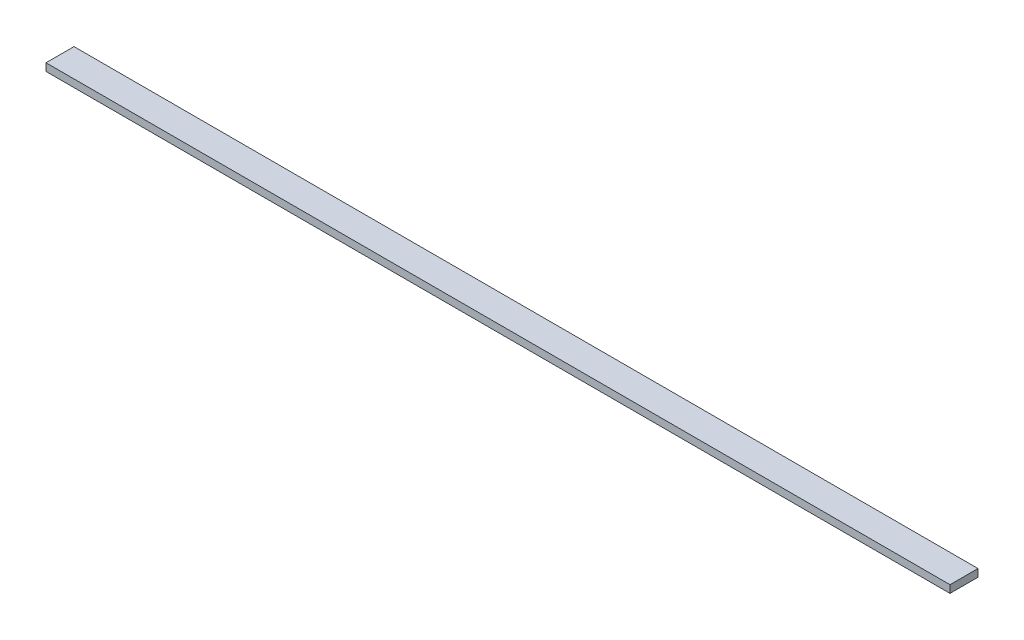
ISO-10303-21;
HEADER;
FILE_DESCRIPTION(('STEP AP214'),'2;1');
FILE_NAME('part.step','',(''),(''),'','','');
FILE_SCHEMA(('AUTOMOTIVE_DESIGN { 1 0 10303 214 1 1 1 1 }'));
ENDSEC;
DATA;
#1=APPLICATION_CONTEXT('core data for automotive mechanical design processes');
#2=APPLICATION_PROTOCOL_DEFINITION('international standard','automotive_design',2000,#1);
#3=PRODUCT_CONTEXT('',#1,'mechanical');
#4=PRODUCT('Part','Part','',(#3));
#5=PRODUCT_RELATED_PRODUCT_CATEGORY('part','',(#4));
#6=PRODUCT_DEFINITION_FORMATION('','',#4);
#7=PRODUCT_DEFINITION_CONTEXT('part definition',#1,'design');
#8=PRODUCT_DEFINITION('design','',#6,#7);
#9=PRODUCT_DEFINITION_SHAPE('','',#8);
#10=(LENGTH_UNIT() NAMED_UNIT(*) SI_UNIT(.MILLI.,.METRE.));
#11=(NAMED_UNIT(*) PLANE_ANGLE_UNIT() SI_UNIT($,.RADIAN.));
#12=(NAMED_UNIT(*) SI_UNIT($,.STERADIAN.) SOLID_ANGLE_UNIT());
#13=UNCERTAINTY_MEASURE_WITH_UNIT(LENGTH_MEASURE(1.E-05),#10,'distance_accuracy_value','');
#14=(GEOMETRIC_REPRESENTATION_CONTEXT(3) GLOBAL_UNCERTAINTY_ASSIGNED_CONTEXT((#13)) GLOBAL_UNIT_ASSIGNED_CONTEXT((#10,
#11,#12)) REPRESENTATION_CONTEXT('',''));
#15=CARTESIAN_POINT('',(0.,0.,0.));
#16=DIRECTION('',(0.,0.,1.));
#17=DIRECTION('',(1.,0.,0.));
#18=AXIS2_PLACEMENT_3D('',#15,#16,#17);
#19=CARTESIAN_POINT('',(161.5,0.,10.));
#20=DIRECTION('',(0.,0.,-1.));
#21=DIRECTION('',(-1.,0.,0.));
#22=AXIS2_PLACEMENT_3D('',#19,#20,#21);
#23=PLANE('',#22);
#24=DIRECTION('',(-1.,0.,0.));
#25=VECTOR('',#24,1.);
#26=CARTESIAN_POINT('',(161.5,2.69999999999999,10.));
#27=LINE('',#26,#25);
#28=CARTESIAN_POINT('',(161.5,2.69999999999999,10.));
#29=VERTEX_POINT('',#28);
#30=CARTESIAN_POINT('',(-161.5,2.69999999999999,10.));
#31=VERTEX_POINT('',#30);
#32=EDGE_CURVE('E92',#29,#31,#27,.T.);
#33=ORIENTED_EDGE('',*,*,#32,.T.);
#34=DIRECTION('',(0.,-1.,0.));
#35=VECTOR('',#34,1.);
#36=CARTESIAN_POINT('',(-161.5,0.,10.));
#37=LINE('',#36,#35);
#38=CARTESIAN_POINT('',(-161.5,0.,10.));
#39=VERTEX_POINT('',#38);
#40=EDGE_CURVE('E87',#31,#39,#37,.T.);
#41=ORIENTED_EDGE('',*,*,#40,.T.);
#42=DIRECTION('',(-1.,0.,0.));
#43=VECTOR('',#42,1.);
#44=CARTESIAN_POINT('',(161.5,0.,10.));
#45=LINE('',#44,#43);
#46=CARTESIAN_POINT('',(161.5,0.,10.));
#47=VERTEX_POINT('',#46);
#48=EDGE_CURVE('E11',#47,#39,#45,.T.);
#49=ORIENTED_EDGE('',*,*,#48,.F.);
#50=DIRECTION('',(0.,-1.,0.));
#51=VECTOR('',#50,1.);
#52=CARTESIAN_POINT('',(161.5,0.,10.));
#53=LINE('',#52,#51);
#54=EDGE_CURVE('E98',#29,#47,#53,.T.);
#55=ORIENTED_EDGE('',*,*,#54,.F.);
#56=EDGE_LOOP('',(#33,#41,#49,#55));
#57=FACE_BOUND('',#56,.T.);
#58=ADVANCED_FACE('F35',(#57),#23,.F.);
#59=CARTESIAN_POINT('',(161.5,0.,10.));
#60=DIRECTION('',(0.,1.,0.));
#61=DIRECTION('',(0.,0.,1.));
#62=AXIS2_PLACEMENT_3D('',#59,#60,#61);
#63=PLANE('',#62);
#64=ORIENTED_EDGE('',*,*,#48,.T.);
#65=DIRECTION('',(0.,0.,-1.));
#66=VECTOR('',#65,1.);
#67=CARTESIAN_POINT('',(-161.5,0.,10.));
#68=LINE('',#67,#66);
#69=CARTESIAN_POINT('',(-161.5,0.,0.));
#70=VERTEX_POINT('',#69);
#71=EDGE_CURVE('E77',#39,#70,#68,.T.);
#72=ORIENTED_EDGE('',*,*,#71,.T.);
#73=DIRECTION('',(-1.,0.,0.));
#74=VECTOR('',#73,1.);
#75=CARTESIAN_POINT('',(161.5,0.,0.));
#76=LINE('',#75,#74);
#77=CARTESIAN_POINT('',(161.5,0.,0.));
#78=VERTEX_POINT('',#77);
#79=EDGE_CURVE('E42',#78,#70,#76,.T.);
#80=ORIENTED_EDGE('',*,*,#79,.F.);
#81=DIRECTION('',(0.,0.,-1.));
#82=VECTOR('',#81,1.);
#83=CARTESIAN_POINT('',(161.5,0.,10.));
#84=LINE('',#83,#82);
#85=EDGE_CURVE('E78',#47,#78,#84,.T.);
#86=ORIENTED_EDGE('',*,*,#85,.F.);
#87=EDGE_LOOP('',(#64,#72,#80,#86));
#88=FACE_BOUND('',#87,.T.);
#89=ADVANCED_FACE('F75',(#88),#63,.F.);
#90=CARTESIAN_POINT('',(161.5,0.,0.));
#91=DIRECTION('',(0.,0.,1.));
#92=DIRECTION('',(1.,0.,0.));
#93=AXIS2_PLACEMENT_3D('',#90,#91,#92);
#94=PLANE('',#93);
#95=ORIENTED_EDGE('',*,*,#79,.T.);
#96=DIRECTION('',(0.,1.,0.));
#97=VECTOR('',#96,1.);
#98=CARTESIAN_POINT('',(-161.5,0.,0.));
#99=LINE('',#98,#97);
#100=CARTESIAN_POINT('',(-161.5,2.69999999999999,0.));
#101=VERTEX_POINT('',#100);
#102=EDGE_CURVE('E90',#70,#101,#99,.T.);
#103=ORIENTED_EDGE('',*,*,#102,.T.);
#104=DIRECTION('',(-1.,0.,0.));
#105=VECTOR('',#104,1.);
#106=CARTESIAN_POINT('',(161.5,2.69999999999999,0.));
#107=LINE('',#106,#105);
#108=CARTESIAN_POINT('',(161.5,2.69999999999999,0.));
#109=VERTEX_POINT('',#108);
#110=EDGE_CURVE('E104',#109,#101,#107,.T.);
#111=ORIENTED_EDGE('',*,*,#110,.F.);
#112=DIRECTION('',(0.,1.,0.));
#113=VECTOR('',#112,1.);
#114=CARTESIAN_POINT('',(161.5,0.,0.));
#115=LINE('',#114,#113);
#116=EDGE_CURVE('E54',#78,#109,#115,.T.);
#117=ORIENTED_EDGE('',*,*,#116,.F.);
#118=EDGE_LOOP('',(#95,#103,#111,#117));
#119=FACE_BOUND('',#118,.T.);
#120=ADVANCED_FACE('F106',(#119),#94,.F.);
#121=CARTESIAN_POINT('',(161.5,2.69999999999999,10.));
#122=DIRECTION('',(0.,-1.,0.));
#123=DIRECTION('',(0.,0.,-1.));
#124=AXIS2_PLACEMENT_3D('',#121,#122,#123);
#125=PLANE('',#124);
#126=ORIENTED_EDGE('',*,*,#110,.T.);
#127=DIRECTION('',(0.,0.,1.));
#128=VECTOR('',#127,1.);
#129=CARTESIAN_POINT('',(-161.5,2.69999999999999,10.));
#130=LINE('',#129,#128);
#131=EDGE_CURVE('E96',#101,#31,#130,.T.);
#132=ORIENTED_EDGE('',*,*,#131,.T.);
#133=ORIENTED_EDGE('',*,*,#32,.F.);
#134=DIRECTION('',(0.,0.,1.));
#135=VECTOR('',#134,1.);
#136=CARTESIAN_POINT('',(161.5,2.69999999999999,10.));
#137=LINE('',#136,#135);
#138=EDGE_CURVE('E49',#109,#29,#137,.T.);
#139=ORIENTED_EDGE('',*,*,#138,.F.);
#140=EDGE_LOOP('',(#126,#132,#133,#139));
#141=FACE_BOUND('',#140,.T.);
#142=ADVANCED_FACE('F108',(#141),#125,.F.);
#143=CARTESIAN_POINT('',(161.5,2.69999999999999,10.));
#144=DIRECTION('',(-1.,0.,0.));
#145=DIRECTION('',(0.,0.,1.));
#146=AXIS2_PLACEMENT_3D('',#143,#144,#145);
#147=PLANE('',#146);
#148=ORIENTED_EDGE('',*,*,#54,.T.);
#149=ORIENTED_EDGE('',*,*,#85,.T.);
#150=ORIENTED_EDGE('',*,*,#116,.T.);
#151=ORIENTED_EDGE('',*,*,#138,.T.);
#152=EDGE_LOOP('',(#148,#149,#150,#151));
#153=FACE_BOUND('',#152,.T.);
#154=ADVANCED_FACE('F109',(#153),#147,.F.);
#155=CARTESIAN_POINT('',(-161.5,2.69999999999999,10.));
#156=DIRECTION('',(-1.,0.,0.));
#157=DIRECTION('',(0.,0.,1.));
#158=AXIS2_PLACEMENT_3D('',#155,#156,#157);
#159=PLANE('',#158);
#160=ORIENTED_EDGE('',*,*,#40,.F.);
#161=ORIENTED_EDGE('',*,*,#131,.F.);
#162=ORIENTED_EDGE('',*,*,#102,.F.);
#163=ORIENTED_EDGE('',*,*,#71,.F.);
#164=EDGE_LOOP('',(#160,#161,#162,#163));
#165=FACE_BOUND('',#164,.T.);
#166=ADVANCED_FACE('F85',(#165),#159,.T.);
#167=CLOSED_SHELL('',(#58,#89,#120,#142,#154,#166));
#168=MANIFOLD_SOLID_BREP('B2',#167);
#169=ADVANCED_BREP_SHAPE_REPRESENTATION('',(#18,#168),#14);
#170=SHAPE_DEFINITION_REPRESENTATION(#9,#169);
ENDSEC;
END-ISO-10303-21;
